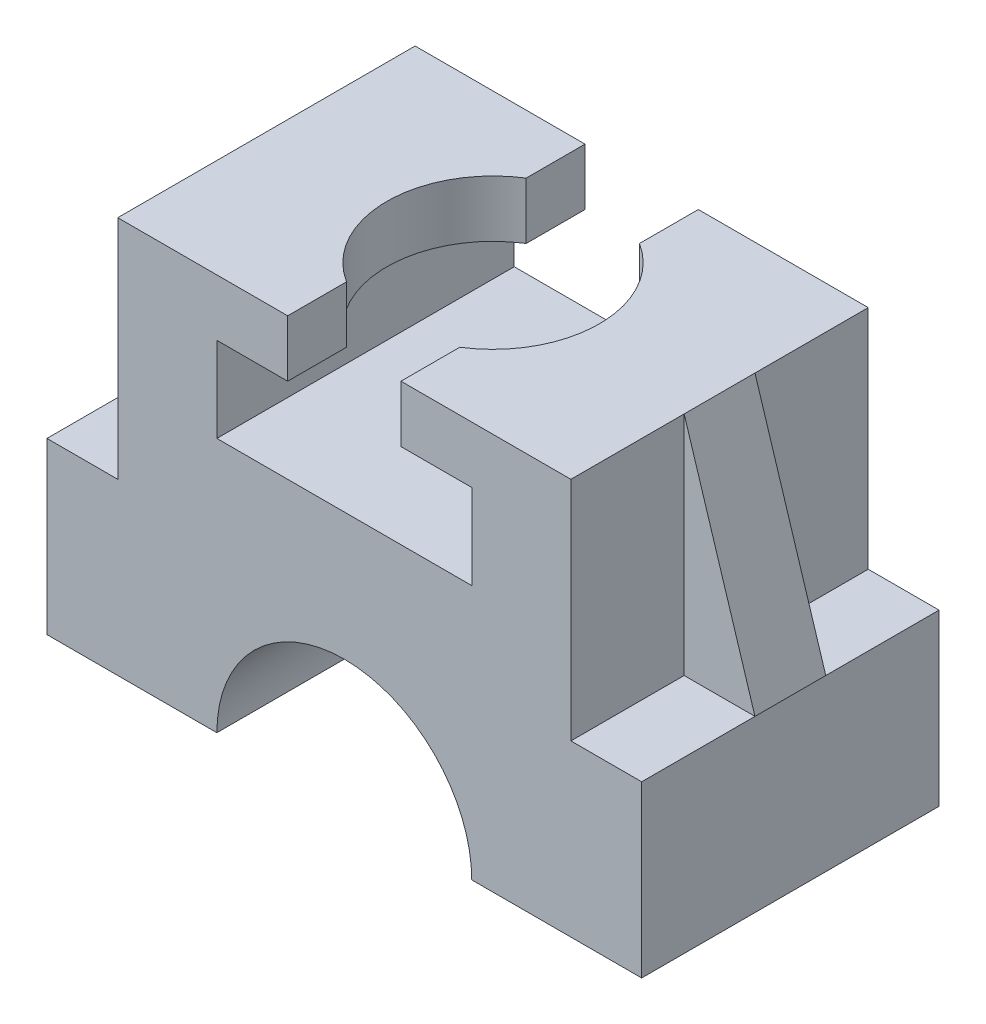
ISO-10303-21;
HEADER;
FILE_DESCRIPTION(('STEP AP214'),'2;1');
FILE_NAME('part.step','',(''),(''),'','','');
FILE_SCHEMA(('AUTOMOTIVE_DESIGN { 1 0 10303 214 1 1 1 1 }'));
ENDSEC;
DATA;
#1=APPLICATION_CONTEXT('core data for automotive mechanical design processes');
#2=APPLICATION_PROTOCOL_DEFINITION('international standard','automotive_design',2000,#1);
#3=PRODUCT_CONTEXT('',#1,'mechanical');
#4=PRODUCT('Part','Part','',(#3));
#5=PRODUCT_RELATED_PRODUCT_CATEGORY('part','',(#4));
#6=PRODUCT_DEFINITION_FORMATION('','',#4);
#7=PRODUCT_DEFINITION_CONTEXT('part definition',#1,'design');
#8=PRODUCT_DEFINITION('design','',#6,#7);
#9=PRODUCT_DEFINITION_SHAPE('','',#8);
#10=(LENGTH_UNIT() NAMED_UNIT(*) SI_UNIT(.MILLI.,.METRE.));
#11=(NAMED_UNIT(*) PLANE_ANGLE_UNIT() SI_UNIT($,.RADIAN.));
#12=(NAMED_UNIT(*) SI_UNIT($,.STERADIAN.) SOLID_ANGLE_UNIT());
#13=UNCERTAINTY_MEASURE_WITH_UNIT(LENGTH_MEASURE(1.E-05),#10,'distance_accuracy_value','');
#14=(GEOMETRIC_REPRESENTATION_CONTEXT(3) GLOBAL_UNCERTAINTY_ASSIGNED_CONTEXT((#13)) GLOBAL_UNIT_ASSIGNED_CONTEXT((#10,
#11,#12)) REPRESENTATION_CONTEXT('',''));
#15=CARTESIAN_POINT('',(0.,0.,0.));
#16=DIRECTION('',(0.,0.,1.));
#17=DIRECTION('',(1.,0.,0.));
#18=AXIS2_PLACEMENT_3D('',#15,#16,#17);
#19=CARTESIAN_POINT('',(-20.,140.,-52.5));
#20=DIRECTION('',(1.,0.,0.));
#21=DIRECTION('',(0.,1.,0.));
#22=AXIS2_PLACEMENT_3D('',#19,#20,#21);
#23=PLANE('',#22);
#24=DIRECTION('',(0.,1.,0.));
#25=VECTOR('',#24,1.);
#26=CARTESIAN_POINT('',(-20.,13.9339828220179,-31.7214438511238));
#27=LINE('',#26,#25);
#28=CARTESIAN_POINT('',(-20.,120.,-31.7214438511238));
#29=VERTEX_POINT('',#28);
#30=CARTESIAN_POINT('',(-20.,140.,-31.7214438511238));
#31=VERTEX_POINT('',#30);
#32=EDGE_CURVE('E381',#29,#31,#27,.T.);
#33=ORIENTED_EDGE('',*,*,#32,.F.);
#34=DIRECTION('',(0.,0.,1.));
#35=VECTOR('',#34,1.);
#36=CARTESIAN_POINT('',(-20.,120.,-52.5));
#37=LINE('',#36,#35);
#38=CARTESIAN_POINT('',(-20.,120.,-52.5));
#39=VERTEX_POINT('',#38);
#40=EDGE_CURVE('E348',#39,#29,#37,.T.);
#41=ORIENTED_EDGE('',*,*,#40,.F.);
#42=DIRECTION('',(0.,1.,0.));
#43=VECTOR('',#42,1.);
#44=CARTESIAN_POINT('',(-20.,140.,-52.5));
#45=LINE('',#44,#43);
#46=CARTESIAN_POINT('',(-20.,140.,-52.5));
#47=VERTEX_POINT('',#46);
#48=EDGE_CURVE('E456',#39,#47,#45,.T.);
#49=ORIENTED_EDGE('',*,*,#48,.T.);
#50=DIRECTION('',(0.,0.,1.));
#51=VECTOR('',#50,1.);
#52=CARTESIAN_POINT('',(-20.,140.,-52.5));
#53=LINE('',#52,#51);
#54=EDGE_CURVE('E344',#47,#31,#53,.T.);
#55=ORIENTED_EDGE('',*,*,#54,.T.);
#56=EDGE_LOOP('',(#33,#41,#49,#55));
#57=FACE_BOUND('',#56,.T.);
#58=ADVANCED_FACE('F32',(#57),#23,.T.);
#59=CARTESIAN_POINT('',(20.,140.,-52.5));
#60=DIRECTION('',(-1.,0.,0.));
#61=DIRECTION('',(0.,-1.,0.));
#62=AXIS2_PLACEMENT_3D('',#59,#60,#61);
#63=PLANE('',#62);
#64=DIRECTION('',(0.,1.,0.));
#65=VECTOR('',#64,1.);
#66=CARTESIAN_POINT('',(20.,13.9339828220179,31.7214438511238));
#67=LINE('',#66,#65);
#68=CARTESIAN_POINT('',(20.,120.,31.7214438511238));
#69=VERTEX_POINT('',#68);
#70=CARTESIAN_POINT('',(20.,140.,31.7214438511238));
#71=VERTEX_POINT('',#70);
#72=EDGE_CURVE('E57',#69,#71,#67,.T.);
#73=ORIENTED_EDGE('',*,*,#72,.F.);
#74=DIRECTION('',(0.,0.,1.));
#75=VECTOR('',#74,1.);
#76=CARTESIAN_POINT('',(20.,120.,-52.5));
#77=LINE('',#76,#75);
#78=CARTESIAN_POINT('',(20.,120.,52.5));
#79=VERTEX_POINT('',#78);
#80=EDGE_CURVE('E240',#69,#79,#77,.T.);
#81=ORIENTED_EDGE('',*,*,#80,.T.);
#82=DIRECTION('',(0.,-1.,0.));
#83=VECTOR('',#82,1.);
#84=CARTESIAN_POINT('',(20.,140.,52.5));
#85=LINE('',#84,#83);
#86=CARTESIAN_POINT('',(20.,140.,52.5));
#87=VERTEX_POINT('',#86);
#88=EDGE_CURVE('E305',#87,#79,#85,.T.);
#89=ORIENTED_EDGE('',*,*,#88,.F.);
#90=DIRECTION('',(0.,0.,1.));
#91=VECTOR('',#90,1.);
#92=CARTESIAN_POINT('',(20.,140.,-52.5));
#93=LINE('',#92,#91);
#94=EDGE_CURVE('E241',#71,#87,#93,.T.);
#95=ORIENTED_EDGE('',*,*,#94,.F.);
#96=EDGE_LOOP('',(#73,#81,#89,#95));
#97=FACE_BOUND('',#96,.T.);
#98=ADVANCED_FACE('F376',(#97),#63,.T.);
#99=CARTESIAN_POINT('',(-105.,60.,-52.5));
#100=DIRECTION('',(0.,1.,0.));
#101=DIRECTION('',(0.,0.,1.));
#102=AXIS2_PLACEMENT_3D('',#99,#100,#101);
#103=PLANE('',#102);
#104=DIRECTION('',(0.,0.,1.));
#105=VECTOR('',#104,1.);
#106=CARTESIAN_POINT('',(-105.,60.,-52.5));
#107=LINE('',#106,#105);
#108=CARTESIAN_POINT('',(-105.,60.,-52.5));
#109=VERTEX_POINT('',#108);
#110=CARTESIAN_POINT('',(-105.,59.9999999999999,-12.5));
#111=VERTEX_POINT('',#110);
#112=EDGE_CURVE('E11',#109,#111,#107,.T.);
#113=ORIENTED_EDGE('',*,*,#112,.T.);
#114=DIRECTION('',(1.,0.,0.));
#115=VECTOR('',#114,1.);
#116=CARTESIAN_POINT('',(-80.,59.9999999999999,-12.5));
#117=LINE('',#116,#115);
#118=CARTESIAN_POINT('',(-80.,59.9999999999999,-12.5));
#119=VERTEX_POINT('',#118);
#120=EDGE_CURVE('E383',#111,#119,#117,.T.);
#121=ORIENTED_EDGE('',*,*,#120,.T.);
#122=DIRECTION('',(0.,0.,1.));
#123=VECTOR('',#122,1.);
#124=CARTESIAN_POINT('',(-80.,60.,-52.5));
#125=LINE('',#124,#123);
#126=CARTESIAN_POINT('',(-80.,60.,-52.5));
#127=VERTEX_POINT('',#126);
#128=EDGE_CURVE('E336',#127,#119,#125,.T.);
#129=ORIENTED_EDGE('',*,*,#128,.F.);
#130=DIRECTION('',(-1.,0.,0.));
#131=VECTOR('',#130,1.);
#132=CARTESIAN_POINT('',(-105.,60.,-52.5));
#133=LINE('',#132,#131);
#134=EDGE_CURVE('E266',#127,#109,#133,.T.);
#135=ORIENTED_EDGE('',*,*,#134,.T.);
#136=EDGE_LOOP('',(#113,#121,#129,#135));
#137=FACE_BOUND('',#136,.T.);
#138=ADVANCED_FACE('F505',(#137),#103,.T.);
#139=CARTESIAN_POINT('',(-80.,60.,-52.5));
#140=DIRECTION('',(-1.,0.,0.));
#141=DIRECTION('',(0.,0.,1.));
#142=AXIS2_PLACEMENT_3D('',#139,#140,#141);
#143=PLANE('',#142);
#144=ORIENTED_EDGE('',*,*,#128,.T.);
#145=DIRECTION('',(0.,1.,0.));
#146=VECTOR('',#145,1.);
#147=CARTESIAN_POINT('',(-80.,140.,-12.5));
#148=LINE('',#147,#146);
#149=CARTESIAN_POINT('',(-80.,140.,-12.5));
#150=VERTEX_POINT('',#149);
#151=EDGE_CURVE('E395',#119,#150,#148,.T.);
#152=ORIENTED_EDGE('',*,*,#151,.T.);
#153=DIRECTION('',(0.,0.,1.));
#154=VECTOR('',#153,1.);
#155=CARTESIAN_POINT('',(-80.,140.,-52.5));
#156=LINE('',#155,#154);
#157=CARTESIAN_POINT('',(-80.,140.,-52.5));
#158=VERTEX_POINT('',#157);
#159=EDGE_CURVE('E340',#158,#150,#156,.T.);
#160=ORIENTED_EDGE('',*,*,#159,.F.);
#161=DIRECTION('',(0.,-1.,0.));
#162=VECTOR('',#161,1.);
#163=CARTESIAN_POINT('',(-80.,60.,-52.5));
#164=LINE('',#163,#162);
#165=EDGE_CURVE('E271',#158,#127,#164,.T.);
#166=ORIENTED_EDGE('',*,*,#165,.T.);
#167=EDGE_LOOP('',(#144,#152,#160,#166));
#168=FACE_BOUND('',#167,.T.);
#169=ADVANCED_FACE('F510',(#168),#143,.T.);
#170=CARTESIAN_POINT('',(80.,60.,-52.5));
#171=DIRECTION('',(1.,0.,0.));
#172=DIRECTION('',(0.,0.,-1.));
#173=AXIS2_PLACEMENT_3D('',#170,#171,#172);
#174=PLANE('',#173);
#175=DIRECTION('',(0.,0.,1.));
#176=VECTOR('',#175,1.);
#177=CARTESIAN_POINT('',(80.,60.,-52.5));
#178=LINE('',#177,#176);
#179=CARTESIAN_POINT('',(80.,60.,12.5));
#180=VERTEX_POINT('',#179);
#181=CARTESIAN_POINT('',(80.,60.,52.5));
#182=VERTEX_POINT('',#181);
#183=EDGE_CURVE('E253',#180,#182,#178,.T.);
#184=ORIENTED_EDGE('',*,*,#183,.F.);
#185=DIRECTION('',(0.,-1.,0.));
#186=VECTOR('',#185,1.);
#187=CARTESIAN_POINT('',(80.,140.,12.5));
#188=LINE('',#187,#186);
#189=CARTESIAN_POINT('',(80.,140.,12.5));
#190=VERTEX_POINT('',#189);
#191=EDGE_CURVE('E406',#190,#180,#188,.T.);
#192=ORIENTED_EDGE('',*,*,#191,.F.);
#193=DIRECTION('',(0.,0.,1.));
#194=VECTOR('',#193,1.);
#195=CARTESIAN_POINT('',(80.,140.,-52.5));
#196=LINE('',#195,#194);
#197=CARTESIAN_POINT('',(80.,140.,52.5));
#198=VERTEX_POINT('',#197);
#199=EDGE_CURVE('E249',#190,#198,#196,.T.);
#200=ORIENTED_EDGE('',*,*,#199,.T.);
#201=DIRECTION('',(0.,1.,0.));
#202=VECTOR('',#201,1.);
#203=CARTESIAN_POINT('',(80.,60.,52.5));
#204=LINE('',#203,#202);
#205=EDGE_CURVE('E299',#182,#198,#204,.T.);
#206=ORIENTED_EDGE('',*,*,#205,.F.);
#207=EDGE_LOOP('',(#184,#192,#200,#206));
#208=FACE_BOUND('',#207,.T.);
#209=ADVANCED_FACE('F662',(#208),#174,.T.);
#210=CARTESIAN_POINT('',(105.,60.,-52.5));
#211=DIRECTION('',(0.,1.,0.));
#212=DIRECTION('',(0.,0.,1.));
#213=AXIS2_PLACEMENT_3D('',#210,#211,#212);
#214=PLANE('',#213);
#215=DIRECTION('',(0.,0.,1.));
#216=VECTOR('',#215,1.);
#217=CARTESIAN_POINT('',(105.,60.,-52.5));
#218=LINE('',#217,#216);
#219=CARTESIAN_POINT('',(105.,60.,12.5));
#220=VERTEX_POINT('',#219);
#221=CARTESIAN_POINT('',(105.,60.,52.5));
#222=VERTEX_POINT('',#221);
#223=EDGE_CURVE('E257',#220,#222,#218,.T.);
#224=ORIENTED_EDGE('',*,*,#223,.F.);
#225=DIRECTION('',(1.,0.,0.));
#226=VECTOR('',#225,1.);
#227=CARTESIAN_POINT('',(80.,60.,12.5));
#228=LINE('',#227,#226);
#229=EDGE_CURVE('E409',#180,#220,#228,.T.);
#230=ORIENTED_EDGE('',*,*,#229,.F.);
#231=ORIENTED_EDGE('',*,*,#183,.T.);
#232=DIRECTION('',(-1.,0.,0.));
#233=VECTOR('',#232,1.);
#234=CARTESIAN_POINT('',(105.,60.,52.5));
#235=LINE('',#234,#233);
#236=EDGE_CURVE('E296',#222,#182,#235,.T.);
#237=ORIENTED_EDGE('',*,*,#236,.F.);
#238=EDGE_LOOP('',(#224,#230,#231,#237));
#239=FACE_BOUND('',#238,.T.);
#240=ADVANCED_FACE('F668',(#239),#214,.T.);
#241=CARTESIAN_POINT('',(-105.,0.,-52.5));
#242=DIRECTION('',(-1.,0.,0.));
#243=DIRECTION('',(0.,0.,1.));
#244=AXIS2_PLACEMENT_3D('',#241,#242,#243);
#245=PLANE('',#244);
#246=DIRECTION('',(0.,-1.,0.));
#247=VECTOR('',#246,1.);
#248=CARTESIAN_POINT('',(-105.,0.,52.5));
#249=LINE('',#248,#247);
#250=CARTESIAN_POINT('',(-105.,60.,52.5));
#251=VERTEX_POINT('',#250);
#252=CARTESIAN_POINT('',(-105.,0.,52.5));
#253=VERTEX_POINT('',#252);
#254=EDGE_CURVE('E280',#251,#253,#249,.T.);
#255=ORIENTED_EDGE('',*,*,#254,.F.);
#256=CARTESIAN_POINT('',(-105.,59.9999999999999,12.5));
#257=VERTEX_POINT('',#256);
#258=EDGE_CURVE('E41',#257,#251,#107,.T.);
#259=ORIENTED_EDGE('',*,*,#258,.F.);
#260=DIRECTION('',(0.,0.,-1.));
#261=VECTOR('',#260,1.);
#262=CARTESIAN_POINT('',(-105.,59.9999999999999,12.5));
#263=LINE('',#262,#261);
#264=EDGE_CURVE('E392',#257,#111,#263,.T.);
#265=ORIENTED_EDGE('',*,*,#264,.T.);
#266=ORIENTED_EDGE('',*,*,#112,.F.);
#267=DIRECTION('',(0.,-1.,0.));
#268=VECTOR('',#267,1.);
#269=CARTESIAN_POINT('',(-105.,0.,-52.5));
#270=LINE('',#269,#268);
#271=CARTESIAN_POINT('',(-105.,0.,-52.5));
#272=VERTEX_POINT('',#271);
#273=EDGE_CURVE('E334',#109,#272,#270,.T.);
#274=ORIENTED_EDGE('',*,*,#273,.T.);
#275=DIRECTION('',(0.,0.,1.));
#276=VECTOR('',#275,1.);
#277=CARTESIAN_POINT('',(-105.,0.,-52.5));
#278=LINE('',#277,#276);
#279=EDGE_CURVE('E36',#272,#253,#278,.T.);
#280=ORIENTED_EDGE('',*,*,#279,.T.);
#281=EDGE_LOOP('',(#255,#259,#265,#266,#274,#280));
#282=FACE_BOUND('',#281,.T.);
#283=ADVANCED_FACE('F34',(#282),#245,.T.);
#284=DIRECTION('',(1.,0.,0.));
#285=VECTOR('',#284,1.);
#286=CARTESIAN_POINT('',(-80.,59.9999999999999,12.5));
#287=LINE('',#286,#285);
#288=CARTESIAN_POINT('',(-80.,59.9999999999999,12.5));
#289=VERTEX_POINT('',#288);
#290=EDGE_CURVE('E384',#257,#289,#287,.T.);
#291=ORIENTED_EDGE('',*,*,#290,.F.);
#292=ORIENTED_EDGE('',*,*,#258,.T.);
#293=DIRECTION('',(-1.,0.,0.));
#294=VECTOR('',#293,1.);
#295=CARTESIAN_POINT('',(-105.,60.,52.5));
#296=LINE('',#295,#294);
#297=CARTESIAN_POINT('',(-80.,60.,52.5));
#298=VERTEX_POINT('',#297);
#299=EDGE_CURVE('E332',#298,#251,#296,.T.);
#300=ORIENTED_EDGE('',*,*,#299,.F.);
#301=EDGE_CURVE('E339',#289,#298,#125,.T.);
#302=ORIENTED_EDGE('',*,*,#301,.F.);
#303=EDGE_LOOP('',(#291,#292,#300,#302));
#304=FACE_BOUND('',#303,.T.);
#305=ADVANCED_FACE('F550',(#304),#103,.T.);
#306=DIRECTION('',(0.,1.,0.));
#307=VECTOR('',#306,1.);
#308=CARTESIAN_POINT('',(-80.,140.,12.5));
#309=LINE('',#308,#307);
#310=CARTESIAN_POINT('',(-80.,140.,12.5));
#311=VERTEX_POINT('',#310);
#312=EDGE_CURVE('E386',#289,#311,#309,.T.);
#313=ORIENTED_EDGE('',*,*,#312,.F.);
#314=ORIENTED_EDGE('',*,*,#301,.T.);
#315=DIRECTION('',(0.,-1.,0.));
#316=VECTOR('',#315,1.);
#317=CARTESIAN_POINT('',(-80.,60.,52.5));
#318=LINE('',#317,#316);
#319=CARTESIAN_POINT('',(-80.,140.,52.5));
#320=VERTEX_POINT('',#319);
#321=EDGE_CURVE('E329',#320,#298,#318,.T.);
#322=ORIENTED_EDGE('',*,*,#321,.F.);
#323=EDGE_CURVE('E343',#311,#320,#156,.T.);
#324=ORIENTED_EDGE('',*,*,#323,.F.);
#325=EDGE_LOOP('',(#313,#314,#322,#324));
#326=FACE_BOUND('',#325,.T.);
#327=ADVANCED_FACE('F521',(#326),#143,.T.);
#328=CARTESIAN_POINT('',(-80.,140.,-52.5));
#329=DIRECTION('',(0.,1.,0.));
#330=DIRECTION('',(0.,0.,1.));
#331=AXIS2_PLACEMENT_3D('',#328,#329,#330);
#332=PLANE('',#331);
#333=CARTESIAN_POINT('',(0.,140.,0.));
#334=DIRECTION('',(0.,1.,0.));
#335=DIRECTION('',(0.,0.,1.));
#336=AXIS2_PLACEMENT_3D('',#333,#334,#335);
#337=CIRCLE('',#336,37.5);
#338=CARTESIAN_POINT('',(-20.,140.,31.7214438511238));
#339=VERTEX_POINT('',#338);
#340=EDGE_CURVE('E225',#31,#339,#337,.T.);
#341=ORIENTED_EDGE('',*,*,#340,.F.);
#342=ORIENTED_EDGE('',*,*,#54,.F.);
#343=DIRECTION('',(-1.,0.,0.));
#344=VECTOR('',#343,1.);
#345=CARTESIAN_POINT('',(-80.,140.,-52.5));
#346=LINE('',#345,#344);
#347=EDGE_CURVE('E276',#47,#158,#346,.T.);
#348=ORIENTED_EDGE('',*,*,#347,.T.);
#349=ORIENTED_EDGE('',*,*,#159,.T.);
#350=DIRECTION('',(0.,0.,-1.));
#351=VECTOR('',#350,1.);
#352=CARTESIAN_POINT('',(-80.,140.,12.5));
#353=LINE('',#352,#351);
#354=EDGE_CURVE('E401',#311,#150,#353,.T.);
#355=ORIENTED_EDGE('',*,*,#354,.F.);
#356=ORIENTED_EDGE('',*,*,#323,.T.);
#357=DIRECTION('',(-1.,0.,0.));
#358=VECTOR('',#357,1.);
#359=CARTESIAN_POINT('',(-80.,140.,52.5));
#360=LINE('',#359,#358);
#361=CARTESIAN_POINT('',(-20.,140.,52.5));
#362=VERTEX_POINT('',#361);
#363=EDGE_CURVE('E326',#362,#320,#360,.T.);
#364=ORIENTED_EDGE('',*,*,#363,.F.);
#365=EDGE_CURVE('E347',#339,#362,#53,.T.);
#366=ORIENTED_EDGE('',*,*,#365,.F.);
#367=EDGE_LOOP('',(#341,#342,#348,#349,#355,#356,#364,#366));
#368=FACE_BOUND('',#367,.T.);
#369=ADVANCED_FACE('F462',(#368),#332,.T.);
#370=DIRECTION('',(0.,1.,0.));
#371=VECTOR('',#370,1.);
#372=CARTESIAN_POINT('',(-20.,13.9339828220179,31.7214438511238));
#373=LINE('',#372,#371);
#374=CARTESIAN_POINT('',(-20.,120.,31.7214438511238));
#375=VERTEX_POINT('',#374);
#376=EDGE_CURVE('E49',#339,#375,#373,.F.);
#377=ORIENTED_EDGE('',*,*,#376,.F.);
#378=ORIENTED_EDGE('',*,*,#365,.T.);
#379=DIRECTION('',(0.,1.,0.));
#380=VECTOR('',#379,1.);
#381=CARTESIAN_POINT('',(-20.,140.,52.5));
#382=LINE('',#381,#380);
#383=CARTESIAN_POINT('',(-20.,120.,52.5));
#384=VERTEX_POINT('',#383);
#385=EDGE_CURVE('E323',#384,#362,#382,.T.);
#386=ORIENTED_EDGE('',*,*,#385,.F.);
#387=EDGE_CURVE('E351',#375,#384,#37,.T.);
#388=ORIENTED_EDGE('',*,*,#387,.F.);
#389=EDGE_LOOP('',(#377,#378,#386,#388));
#390=FACE_BOUND('',#389,.T.);
#391=ADVANCED_FACE('F526',(#390),#23,.T.);
#392=CARTESIAN_POINT('',(-20.,120.,-52.5));
#393=DIRECTION('',(0.,-1.,0.));
#394=DIRECTION('',(0.,0.,-1.));
#395=AXIS2_PLACEMENT_3D('',#392,#393,#394);
#396=PLANE('',#395);
#397=CARTESIAN_POINT('',(0.,120.,0.));
#398=DIRECTION('',(0.,-1.,0.));
#399=DIRECTION('',(0.,0.,-1.));
#400=AXIS2_PLACEMENT_3D('',#397,#398,#399);
#401=CIRCLE('',#400,37.5);
#402=EDGE_CURVE('E234',#29,#375,#401,.F.);
#403=ORIENTED_EDGE('',*,*,#402,.T.);
#404=ORIENTED_EDGE('',*,*,#387,.T.);
#405=DIRECTION('',(1.,0.,0.));
#406=VECTOR('',#405,1.);
#407=CARTESIAN_POINT('',(-20.,120.,52.5));
#408=LINE('',#407,#406);
#409=CARTESIAN_POINT('',(-45.,120.,52.5));
#410=VERTEX_POINT('',#409);
#411=EDGE_CURVE('E320',#410,#384,#408,.T.);
#412=ORIENTED_EDGE('',*,*,#411,.F.);
#413=DIRECTION('',(0.,0.,1.));
#414=VECTOR('',#413,1.);
#415=CARTESIAN_POINT('',(-45.,120.,-52.5));
#416=LINE('',#415,#414);
#417=CARTESIAN_POINT('',(-45.,120.,-52.5));
#418=VERTEX_POINT('',#417);
#419=EDGE_CURVE('E352',#418,#410,#416,.T.);
#420=ORIENTED_EDGE('',*,*,#419,.F.);
#421=DIRECTION('',(1.,0.,0.));
#422=VECTOR('',#421,1.);
#423=CARTESIAN_POINT('',(-20.,120.,-52.5));
#424=LINE('',#423,#422);
#425=EDGE_CURVE('E453',#418,#39,#424,.T.);
#426=ORIENTED_EDGE('',*,*,#425,.T.);
#427=ORIENTED_EDGE('',*,*,#40,.T.);
#428=EDGE_LOOP('',(#403,#404,#412,#420,#426,#427));
#429=FACE_BOUND('',#428,.T.);
#430=ADVANCED_FACE('F473',(#429),#396,.T.);
#431=CARTESIAN_POINT('',(-45.,120.,-52.5));
#432=DIRECTION('',(1.,0.,0.));
#433=DIRECTION('',(0.,1.,0.));
#434=AXIS2_PLACEMENT_3D('',#431,#432,#433);
#435=PLANE('',#434);
#436=DIRECTION('',(0.,1.,0.));
#437=VECTOR('',#436,1.);
#438=CARTESIAN_POINT('',(-45.,120.,52.5));
#439=LINE('',#438,#437);
#440=CARTESIAN_POINT('',(-45.,90.,52.5));
#441=VERTEX_POINT('',#440);
#442=EDGE_CURVE('E317',#441,#410,#439,.T.);
#443=ORIENTED_EDGE('',*,*,#442,.F.);
#444=DIRECTION('',(0.,0.,1.));
#445=VECTOR('',#444,1.);
#446=CARTESIAN_POINT('',(-45.,90.,-52.5));
#447=LINE('',#446,#445);
#448=CARTESIAN_POINT('',(-45.,90.,-52.5));
#449=VERTEX_POINT('',#448);
#450=EDGE_CURVE('E354',#449,#441,#447,.T.);
#451=ORIENTED_EDGE('',*,*,#450,.F.);
#452=DIRECTION('',(0.,1.,0.));
#453=VECTOR('',#452,1.);
#454=CARTESIAN_POINT('',(-45.,120.,-52.5));
#455=LINE('',#454,#453);
#456=EDGE_CURVE('E450',#449,#418,#455,.T.);
#457=ORIENTED_EDGE('',*,*,#456,.T.);
#458=ORIENTED_EDGE('',*,*,#419,.T.);
#459=EDGE_LOOP('',(#443,#451,#457,#458));
#460=FACE_BOUND('',#459,.T.);
#461=ADVANCED_FACE('F480',(#460),#435,.T.);
#462=CARTESIAN_POINT('',(-45.,90.,-52.5));
#463=DIRECTION('',(0.,1.,0.));
#464=DIRECTION('',(-1.,0.,0.));
#465=AXIS2_PLACEMENT_3D('',#462,#463,#464);
#466=PLANE('',#465);
#467=DIRECTION('',(-1.,0.,0.));
#468=VECTOR('',#467,1.);
#469=CARTESIAN_POINT('',(-45.,90.,52.5));
#470=LINE('',#469,#468);
#471=CARTESIAN_POINT('',(45.,90.,52.5));
#472=VERTEX_POINT('',#471);
#473=EDGE_CURVE('E314',#472,#441,#470,.T.);
#474=ORIENTED_EDGE('',*,*,#473,.F.);
#475=DIRECTION('',(0.,0.,1.));
#476=VECTOR('',#475,1.);
#477=CARTESIAN_POINT('',(45.,90.,-52.5));
#478=LINE('',#477,#476);
#479=CARTESIAN_POINT('',(45.,90.,-52.5));
#480=VERTEX_POINT('',#479);
#481=EDGE_CURVE('E356',#480,#472,#478,.T.);
#482=ORIENTED_EDGE('',*,*,#481,.F.);
#483=DIRECTION('',(-1.,0.,0.));
#484=VECTOR('',#483,1.);
#485=CARTESIAN_POINT('',(-45.,90.,-52.5));
#486=LINE('',#485,#484);
#487=EDGE_CURVE('E447',#480,#449,#486,.T.);
#488=ORIENTED_EDGE('',*,*,#487,.T.);
#489=ORIENTED_EDGE('',*,*,#450,.T.);
#490=EDGE_LOOP('',(#474,#482,#488,#489));
#491=FACE_BOUND('',#490,.T.);
#492=ADVANCED_FACE('F482',(#491),#466,.T.);
#493=CARTESIAN_POINT('',(45.,120.,-52.5));
#494=DIRECTION('',(-1.,0.,0.));
#495=DIRECTION('',(0.,-1.,0.));
#496=AXIS2_PLACEMENT_3D('',#493,#494,#495);
#497=PLANE('',#496);
#498=DIRECTION('',(0.,-1.,0.));
#499=VECTOR('',#498,1.);
#500=CARTESIAN_POINT('',(45.,120.,52.5));
#501=LINE('',#500,#499);
#502=CARTESIAN_POINT('',(45.,120.,52.5));
#503=VERTEX_POINT('',#502);
#504=EDGE_CURVE('E311',#503,#472,#501,.T.);
#505=ORIENTED_EDGE('',*,*,#504,.F.);
#506=DIRECTION('',(0.,0.,1.));
#507=VECTOR('',#506,1.);
#508=CARTESIAN_POINT('',(45.,120.,-52.5));
#509=LINE('',#508,#507);
#510=CARTESIAN_POINT('',(45.,120.,-52.5));
#511=VERTEX_POINT('',#510);
#512=EDGE_CURVE('E357',#511,#503,#509,.T.);
#513=ORIENTED_EDGE('',*,*,#512,.F.);
#514=DIRECTION('',(0.,-1.,0.));
#515=VECTOR('',#514,1.);
#516=CARTESIAN_POINT('',(45.,120.,-52.5));
#517=LINE('',#516,#515);
#518=EDGE_CURVE('E445',#511,#480,#517,.T.);
#519=ORIENTED_EDGE('',*,*,#518,.T.);
#520=ORIENTED_EDGE('',*,*,#481,.T.);
#521=EDGE_LOOP('',(#505,#513,#519,#520));
#522=FACE_BOUND('',#521,.T.);
#523=ADVANCED_FACE('F369',(#522),#497,.T.);
#524=CARTESIAN_POINT('',(20.,120.,-52.5));
#525=DIRECTION('',(0.,-1.,0.));
#526=DIRECTION('',(0.,0.,-1.));
#527=AXIS2_PLACEMENT_3D('',#524,#525,#526);
#528=PLANE('',#527);
#529=CARTESIAN_POINT('',(20.,120.,-31.7214438511238));
#530=VERTEX_POINT('',#529);
#531=EDGE_CURVE('E224',#69,#530,#401,.F.);
#532=ORIENTED_EDGE('',*,*,#531,.T.);
#533=CARTESIAN_POINT('',(20.,120.,-52.5));
#534=VERTEX_POINT('',#533);
#535=EDGE_CURVE('E233',#534,#530,#77,.T.);
#536=ORIENTED_EDGE('',*,*,#535,.F.);
#537=DIRECTION('',(1.,0.,0.));
#538=VECTOR('',#537,1.);
#539=CARTESIAN_POINT('',(20.,120.,-52.5));
#540=LINE('',#539,#538);
#541=EDGE_CURVE('E365',#534,#511,#540,.T.);
#542=ORIENTED_EDGE('',*,*,#541,.T.);
#543=ORIENTED_EDGE('',*,*,#512,.T.);
#544=DIRECTION('',(1.,0.,0.));
#545=VECTOR('',#544,1.);
#546=CARTESIAN_POINT('',(20.,120.,52.5));
#547=LINE('',#546,#545);
#548=EDGE_CURVE('E308',#79,#503,#547,.T.);
#549=ORIENTED_EDGE('',*,*,#548,.F.);
#550=ORIENTED_EDGE('',*,*,#80,.F.);
#551=EDGE_LOOP('',(#532,#536,#542,#543,#549,#550));
#552=FACE_BOUND('',#551,.T.);
#553=ADVANCED_FACE('F362',(#552),#528,.T.);
#554=DIRECTION('',(0.,1.,0.));
#555=VECTOR('',#554,1.);
#556=CARTESIAN_POINT('',(20.,13.9339828220179,-31.7214438511238));
#557=LINE('',#556,#555);
#558=CARTESIAN_POINT('',(20.,140.,-31.7214438511238));
#559=VERTEX_POINT('',#558);
#560=EDGE_CURVE('E219',#559,#530,#557,.F.);
#561=ORIENTED_EDGE('',*,*,#560,.F.);
#562=CARTESIAN_POINT('',(20.,140.,-52.5));
#563=VERTEX_POINT('',#562);
#564=EDGE_CURVE('E231',#563,#559,#93,.T.);
#565=ORIENTED_EDGE('',*,*,#564,.F.);
#566=DIRECTION('',(0.,-1.,0.));
#567=VECTOR('',#566,1.);
#568=CARTESIAN_POINT('',(20.,140.,-52.5));
#569=LINE('',#568,#567);
#570=EDGE_CURVE('E442',#563,#534,#569,.T.);
#571=ORIENTED_EDGE('',*,*,#570,.T.);
#572=ORIENTED_EDGE('',*,*,#535,.T.);
#573=EDGE_LOOP('',(#561,#565,#571,#572));
#574=FACE_BOUND('',#573,.T.);
#575=ADVANCED_FACE('F229',(#574),#63,.T.);
#576=CARTESIAN_POINT('',(80.,140.,-52.5));
#577=DIRECTION('',(0.,1.,0.));
#578=DIRECTION('',(0.,0.,1.));
#579=AXIS2_PLACEMENT_3D('',#576,#577,#578);
#580=PLANE('',#579);
#581=EDGE_CURVE('E216',#71,#559,#337,.T.);
#582=ORIENTED_EDGE('',*,*,#581,.F.);
#583=ORIENTED_EDGE('',*,*,#94,.T.);
#584=DIRECTION('',(-1.,0.,0.));
#585=VECTOR('',#584,1.);
#586=CARTESIAN_POINT('',(80.,140.,52.5));
#587=LINE('',#586,#585);
#588=EDGE_CURVE('E302',#198,#87,#587,.T.);
#589=ORIENTED_EDGE('',*,*,#588,.F.);
#590=ORIENTED_EDGE('',*,*,#199,.F.);
#591=DIRECTION('',(0.,0.,-1.));
#592=VECTOR('',#591,1.);
#593=CARTESIAN_POINT('',(80.,140.,12.5));
#594=LINE('',#593,#592);
#595=CARTESIAN_POINT('',(80.,140.,-12.5));
#596=VERTEX_POINT('',#595);
#597=EDGE_CURVE('E284',#190,#596,#594,.T.);
#598=ORIENTED_EDGE('',*,*,#597,.T.);
#599=CARTESIAN_POINT('',(80.,140.,-52.5));
#600=VERTEX_POINT('',#599);
#601=EDGE_CURVE('E244',#600,#596,#196,.T.);
#602=ORIENTED_EDGE('',*,*,#601,.F.);
#603=DIRECTION('',(-1.,0.,0.));
#604=VECTOR('',#603,1.);
#605=CARTESIAN_POINT('',(80.,140.,-52.5));
#606=LINE('',#605,#604);
#607=EDGE_CURVE('E239',#600,#563,#606,.T.);
#608=ORIENTED_EDGE('',*,*,#607,.T.);
#609=ORIENTED_EDGE('',*,*,#564,.T.);
#610=EDGE_LOOP('',(#582,#583,#589,#590,#598,#602,#608,#609));
#611=FACE_BOUND('',#610,.T.);
#612=ADVANCED_FACE('F237',(#611),#580,.T.);
#613=DIRECTION('',(0.,-1.,0.));
#614=VECTOR('',#613,1.);
#615=CARTESIAN_POINT('',(80.,140.,-12.5));
#616=LINE('',#615,#614);
#617=CARTESIAN_POINT('',(80.,60.,-12.5));
#618=VERTEX_POINT('',#617);
#619=EDGE_CURVE('E415',#596,#618,#616,.T.);
#620=ORIENTED_EDGE('',*,*,#619,.T.);
#621=CARTESIAN_POINT('',(80.,60.,-52.5));
#622=VERTEX_POINT('',#621);
#623=EDGE_CURVE('E250',#622,#618,#178,.T.);
#624=ORIENTED_EDGE('',*,*,#623,.F.);
#625=DIRECTION('',(0.,1.,0.));
#626=VECTOR('',#625,1.);
#627=CARTESIAN_POINT('',(80.,60.,-52.5));
#628=LINE('',#627,#626);
#629=EDGE_CURVE('E438',#622,#600,#628,.T.);
#630=ORIENTED_EDGE('',*,*,#629,.T.);
#631=ORIENTED_EDGE('',*,*,#601,.T.);
#632=EDGE_LOOP('',(#620,#624,#630,#631));
#633=FACE_BOUND('',#632,.T.);
#634=ADVANCED_FACE('F486',(#633),#174,.T.);
#635=DIRECTION('',(1.,0.,0.));
#636=VECTOR('',#635,1.);
#637=CARTESIAN_POINT('',(80.,60.,-12.5));
#638=LINE('',#637,#636);
#639=CARTESIAN_POINT('',(105.,60.,-12.5));
#640=VERTEX_POINT('',#639);
#641=EDGE_CURVE('E407',#618,#640,#638,.T.);
#642=ORIENTED_EDGE('',*,*,#641,.T.);
#643=CARTESIAN_POINT('',(105.,60.,-52.5));
#644=VERTEX_POINT('',#643);
#645=EDGE_CURVE('E254',#644,#640,#218,.T.);
#646=ORIENTED_EDGE('',*,*,#645,.F.);
#647=DIRECTION('',(-1.,0.,0.));
#648=VECTOR('',#647,1.);
#649=CARTESIAN_POINT('',(105.,60.,-52.5));
#650=LINE('',#649,#648);
#651=EDGE_CURVE('E435',#644,#622,#650,.T.);
#652=ORIENTED_EDGE('',*,*,#651,.T.);
#653=ORIENTED_EDGE('',*,*,#623,.T.);
#654=EDGE_LOOP('',(#642,#646,#652,#653));
#655=FACE_BOUND('',#654,.T.);
#656=ADVANCED_FACE('F488',(#655),#214,.T.);
#657=CARTESIAN_POINT('',(105.,0.,-52.5));
#658=DIRECTION('',(1.,0.,0.));
#659=DIRECTION('',(0.,0.,-1.));
#660=AXIS2_PLACEMENT_3D('',#657,#658,#659);
#661=PLANE('',#660);
#662=DIRECTION('',(0.,1.,0.));
#663=VECTOR('',#662,1.);
#664=CARTESIAN_POINT('',(105.,0.,52.5));
#665=LINE('',#664,#663);
#666=CARTESIAN_POINT('',(105.,0.,52.5));
#667=VERTEX_POINT('',#666);
#668=EDGE_CURVE('E293',#667,#222,#665,.T.);
#669=ORIENTED_EDGE('',*,*,#668,.F.);
#670=DIRECTION('',(0.,0.,1.));
#671=VECTOR('',#670,1.);
#672=CARTESIAN_POINT('',(105.,0.,-52.5));
#673=LINE('',#672,#671);
#674=CARTESIAN_POINT('',(105.,0.,-52.5));
#675=VERTEX_POINT('',#674);
#676=EDGE_CURVE('E258',#675,#667,#673,.T.);
#677=ORIENTED_EDGE('',*,*,#676,.F.);
#678=DIRECTION('',(0.,1.,0.));
#679=VECTOR('',#678,1.);
#680=CARTESIAN_POINT('',(105.,0.,-52.5));
#681=LINE('',#680,#679);
#682=EDGE_CURVE('E432',#675,#644,#681,.T.);
#683=ORIENTED_EDGE('',*,*,#682,.T.);
#684=ORIENTED_EDGE('',*,*,#645,.T.);
#685=DIRECTION('',(0.,0.,-1.));
#686=VECTOR('',#685,1.);
#687=CARTESIAN_POINT('',(105.,60.,12.5));
#688=LINE('',#687,#686);
#689=EDGE_CURVE('E412',#220,#640,#688,.T.);
#690=ORIENTED_EDGE('',*,*,#689,.F.);
#691=ORIENTED_EDGE('',*,*,#223,.T.);
#692=EDGE_LOOP('',(#669,#677,#683,#684,#690,#691));
#693=FACE_BOUND('',#692,.T.);
#694=ADVANCED_FACE('F493',(#693),#661,.T.);
#695=CARTESIAN_POINT('',(105.,0.,-52.5));
#696=DIRECTION('',(0.,-1.,0.));
#697=DIRECTION('',(0.,0.,-1.));
#698=AXIS2_PLACEMENT_3D('',#695,#696,#697);
#699=PLANE('',#698);
#700=DIRECTION('',(1.,0.,0.));
#701=VECTOR('',#700,1.);
#702=CARTESIAN_POINT('',(105.,0.,52.5));
#703=LINE('',#702,#701);
#704=CARTESIAN_POINT('',(45.,0.,52.5));
#705=VERTEX_POINT('',#704);
#706=EDGE_CURVE('E290',#705,#667,#703,.T.);
#707=ORIENTED_EDGE('',*,*,#706,.F.);
#708=DIRECTION('',(0.,0.,1.));
#709=VECTOR('',#708,1.);
#710=CARTESIAN_POINT('',(45.,0.,-52.5));
#711=LINE('',#710,#709);
#712=CARTESIAN_POINT('',(45.,0.,-52.5));
#713=VERTEX_POINT('',#712);
#714=EDGE_CURVE('E260',#713,#705,#711,.T.);
#715=ORIENTED_EDGE('',*,*,#714,.F.);
#716=DIRECTION('',(1.,0.,0.));
#717=VECTOR('',#716,1.);
#718=CARTESIAN_POINT('',(105.,0.,-52.5));
#719=LINE('',#718,#717);
#720=EDGE_CURVE('E429',#713,#675,#719,.T.);
#721=ORIENTED_EDGE('',*,*,#720,.T.);
#722=ORIENTED_EDGE('',*,*,#676,.T.);
#723=EDGE_LOOP('',(#707,#715,#721,#722));
#724=FACE_BOUND('',#723,.T.);
#725=ADVANCED_FACE('F497',(#724),#699,.T.);
#726=CARTESIAN_POINT('',(0.,0.,-52.5));
#727=DIRECTION('',(0.,0.,1.));
#728=DIRECTION('',(1.,0.,0.));
#729=AXIS2_PLACEMENT_3D('',#726,#727,#728);
#730=CYLINDRICAL_SURFACE('',#729,45.);
#731=CARTESIAN_POINT('',(0.,0.,52.5));
#732=DIRECTION('',(0.,0.,-1.));
#733=DIRECTION('',(1.,0.,0.));
#734=AXIS2_PLACEMENT_3D('',#731,#732,#733);
#735=CIRCLE('',#734,45.);
#736=CARTESIAN_POINT('',(-45.,0.,52.5));
#737=VERTEX_POINT('',#736);
#738=EDGE_CURVE('E287',#737,#705,#735,.T.);
#739=ORIENTED_EDGE('',*,*,#738,.F.);
#740=DIRECTION('',(0.,0.,1.));
#741=VECTOR('',#740,1.);
#742=CARTESIAN_POINT('',(-45.,0.,-52.5));
#743=LINE('',#742,#741);
#744=CARTESIAN_POINT('',(-45.,0.,-52.5));
#745=VERTEX_POINT('',#744);
#746=EDGE_CURVE('E261',#745,#737,#743,.T.);
#747=ORIENTED_EDGE('',*,*,#746,.F.);
#748=CARTESIAN_POINT('',(0.,0.,-52.5));
#749=DIRECTION('',(0.,0.,-1.));
#750=DIRECTION('',(1.,0.,0.));
#751=AXIS2_PLACEMENT_3D('',#748,#749,#750);
#752=CIRCLE('',#751,45.);
#753=EDGE_CURVE('E426',#745,#713,#752,.T.);
#754=ORIENTED_EDGE('',*,*,#753,.T.);
#755=ORIENTED_EDGE('',*,*,#714,.T.);
#756=EDGE_LOOP('',(#739,#747,#754,#755));
#757=FACE_BOUND('',#756,.T.);
#758=ADVANCED_FACE('F501',(#757),#730,.F.);
#759=CARTESIAN_POINT('',(-105.,0.,-52.5));
#760=DIRECTION('',(0.,-1.,0.));
#761=DIRECTION('',(0.,0.,-1.));
#762=AXIS2_PLACEMENT_3D('',#759,#760,#761);
#763=PLANE('',#762);
#764=DIRECTION('',(1.,0.,0.));
#765=VECTOR('',#764,1.);
#766=CARTESIAN_POINT('',(-105.,0.,52.5));
#767=LINE('',#766,#765);
#768=EDGE_CURVE('E283',#253,#737,#767,.T.);
#769=ORIENTED_EDGE('',*,*,#768,.F.);
#770=ORIENTED_EDGE('',*,*,#279,.F.);
#771=DIRECTION('',(1.,0.,0.));
#772=VECTOR('',#771,1.);
#773=CARTESIAN_POINT('',(-105.,0.,-52.5));
#774=LINE('',#773,#772);
#775=EDGE_CURVE('E424',#272,#745,#774,.T.);
#776=ORIENTED_EDGE('',*,*,#775,.T.);
#777=ORIENTED_EDGE('',*,*,#746,.T.);
#778=EDGE_LOOP('',(#769,#770,#776,#777));
#779=FACE_BOUND('',#778,.T.);
#780=ADVANCED_FACE('F502',(#779),#763,.T.);
#781=CARTESIAN_POINT('',(0.,0.,-52.5));
#782=DIRECTION('',(0.,0.,1.));
#783=DIRECTION('',(1.,0.,0.));
#784=AXIS2_PLACEMENT_3D('',#781,#782,#783);
#785=PLANE('',#784);
#786=ORIENTED_EDGE('',*,*,#273,.F.);
#787=ORIENTED_EDGE('',*,*,#134,.F.);
#788=ORIENTED_EDGE('',*,*,#165,.F.);
#789=ORIENTED_EDGE('',*,*,#347,.F.);
#790=ORIENTED_EDGE('',*,*,#48,.F.);
#791=ORIENTED_EDGE('',*,*,#425,.F.);
#792=ORIENTED_EDGE('',*,*,#456,.F.);
#793=ORIENTED_EDGE('',*,*,#487,.F.);
#794=ORIENTED_EDGE('',*,*,#518,.F.);
#795=ORIENTED_EDGE('',*,*,#541,.F.);
#796=ORIENTED_EDGE('',*,*,#570,.F.);
#797=ORIENTED_EDGE('',*,*,#607,.F.);
#798=ORIENTED_EDGE('',*,*,#629,.F.);
#799=ORIENTED_EDGE('',*,*,#651,.F.);
#800=ORIENTED_EDGE('',*,*,#682,.F.);
#801=ORIENTED_EDGE('',*,*,#720,.F.);
#802=ORIENTED_EDGE('',*,*,#753,.F.);
#803=ORIENTED_EDGE('',*,*,#775,.F.);
#804=EDGE_LOOP('',(#786,#787,#788,#789,#790,#791,#792,#793,#794,#795,#796,#797,#798,#799,#800,
#801,#802,#803));
#805=FACE_BOUND('',#804,.T.);
#806=ADVANCED_FACE('F468',(#805),#785,.F.);
#807=CARTESIAN_POINT('',(0.,0.,52.5));
#808=DIRECTION('',(0.,0.,1.));
#809=DIRECTION('',(1.,0.,0.));
#810=AXIS2_PLACEMENT_3D('',#807,#808,#809);
#811=PLANE('',#810);
#812=ORIENTED_EDGE('',*,*,#254,.T.);
#813=ORIENTED_EDGE('',*,*,#768,.T.);
#814=ORIENTED_EDGE('',*,*,#738,.T.);
#815=ORIENTED_EDGE('',*,*,#706,.T.);
#816=ORIENTED_EDGE('',*,*,#668,.T.);
#817=ORIENTED_EDGE('',*,*,#236,.T.);
#818=ORIENTED_EDGE('',*,*,#205,.T.);
#819=ORIENTED_EDGE('',*,*,#588,.T.);
#820=ORIENTED_EDGE('',*,*,#88,.T.);
#821=ORIENTED_EDGE('',*,*,#548,.T.);
#822=ORIENTED_EDGE('',*,*,#504,.T.);
#823=ORIENTED_EDGE('',*,*,#473,.T.);
#824=ORIENTED_EDGE('',*,*,#442,.T.);
#825=ORIENTED_EDGE('',*,*,#411,.T.);
#826=ORIENTED_EDGE('',*,*,#385,.T.);
#827=ORIENTED_EDGE('',*,*,#363,.T.);
#828=ORIENTED_EDGE('',*,*,#321,.T.);
#829=ORIENTED_EDGE('',*,*,#299,.T.);
#830=EDGE_LOOP('',(#812,#813,#814,#815,#816,#817,#818,#819,#820,#821,#822,#823,#824,#825,#826,
#827,#828,#829));
#831=FACE_BOUND('',#830,.T.);
#832=ADVANCED_FACE('F372',(#831),#811,.T.);
#833=CARTESIAN_POINT('',(105.,60.,12.5));
#834=DIRECTION('',(-0.95447997803503,-0.298274993135947,0.));
#835=DIRECTION('',(0.298274993135947,-0.95447997803503,0.));
#836=AXIS2_PLACEMENT_3D('',#833,#834,#835);
#837=PLANE('',#836);
#838=DIRECTION('',(-0.298274993135947,0.95447997803503,0.));
#839=VECTOR('',#838,1.);
#840=CARTESIAN_POINT('',(105.,60.,-12.5));
#841=LINE('',#840,#839);
#842=EDGE_CURVE('E403',#640,#596,#841,.T.);
#843=ORIENTED_EDGE('',*,*,#842,.T.);
#844=ORIENTED_EDGE('',*,*,#597,.F.);
#845=DIRECTION('',(-0.298274993135947,0.95447997803503,0.));
#846=VECTOR('',#845,1.);
#847=CARTESIAN_POINT('',(105.,60.,12.5));
#848=LINE('',#847,#846);
#849=EDGE_CURVE('E404',#220,#190,#848,.T.);
#850=ORIENTED_EDGE('',*,*,#849,.F.);
#851=ORIENTED_EDGE('',*,*,#689,.T.);
#852=EDGE_LOOP('',(#843,#844,#850,#851));
#853=FACE_BOUND('',#852,.T.);
#854=ADVANCED_FACE('F558',(#853),#837,.F.);
#855=CARTESIAN_POINT('',(0.,0.,12.5));
#856=DIRECTION('',(0.,0.,-1.));
#857=DIRECTION('',(-1.,0.,0.));
#858=AXIS2_PLACEMENT_3D('',#855,#856,#857);
#859=PLANE('',#858);
#860=ORIENTED_EDGE('',*,*,#849,.T.);
#861=ORIENTED_EDGE('',*,*,#191,.T.);
#862=ORIENTED_EDGE('',*,*,#229,.T.);
#863=EDGE_LOOP('',(#860,#861,#862));
#864=FACE_BOUND('',#863,.T.);
#865=ADVANCED_FACE('F563',(#864),#859,.F.);
#866=CARTESIAN_POINT('',(0.,0.,-12.5));
#867=DIRECTION('',(0.,0.,-1.));
#868=DIRECTION('',(-1.,0.,0.));
#869=AXIS2_PLACEMENT_3D('',#866,#867,#868);
#870=PLANE('',#869);
#871=ORIENTED_EDGE('',*,*,#842,.F.);
#872=ORIENTED_EDGE('',*,*,#641,.F.);
#873=ORIENTED_EDGE('',*,*,#619,.F.);
#874=EDGE_LOOP('',(#871,#872,#873));
#875=FACE_BOUND('',#874,.T.);
#876=ADVANCED_FACE('F565',(#875),#870,.T.);
#877=CARTESIAN_POINT('',(-105.,59.9999999999999,12.5));
#878=DIRECTION('',(0.95447997803503,-0.298274993135947,0.));
#879=DIRECTION('',(0.298274993135947,0.95447997803503,0.));
#880=AXIS2_PLACEMENT_3D('',#877,#878,#879);
#881=PLANE('',#880);
#882=DIRECTION('',(-0.298274993135947,-0.95447997803503,0.));
#883=VECTOR('',#882,1.);
#884=CARTESIAN_POINT('',(-105.,59.9999999999999,-12.5));
#885=LINE('',#884,#883);
#886=EDGE_CURVE('E387',#150,#111,#885,.T.);
#887=ORIENTED_EDGE('',*,*,#886,.T.);
#888=ORIENTED_EDGE('',*,*,#264,.F.);
#889=DIRECTION('',(-0.298274993135947,-0.95447997803503,0.));
#890=VECTOR('',#889,1.);
#891=CARTESIAN_POINT('',(-105.,59.9999999999999,12.5));
#892=LINE('',#891,#890);
#893=EDGE_CURVE('E390',#311,#257,#892,.T.);
#894=ORIENTED_EDGE('',*,*,#893,.F.);
#895=ORIENTED_EDGE('',*,*,#354,.T.);
#896=EDGE_LOOP('',(#887,#888,#894,#895));
#897=FACE_BOUND('',#896,.T.);
#898=ADVANCED_FACE('F513',(#897),#881,.F.);
#899=CARTESIAN_POINT('',(0.,0.,12.5));
#900=DIRECTION('',(0.,0.,1.));
#901=DIRECTION('',(1.,0.,0.));
#902=AXIS2_PLACEMENT_3D('',#899,#900,#901);
#903=PLANE('',#902);
#904=ORIENTED_EDGE('',*,*,#290,.T.);
#905=ORIENTED_EDGE('',*,*,#312,.T.);
#906=ORIENTED_EDGE('',*,*,#893,.T.);
#907=EDGE_LOOP('',(#904,#905,#906));
#908=FACE_BOUND('',#907,.T.);
#909=ADVANCED_FACE('F574',(#908),#903,.T.);
#910=CARTESIAN_POINT('',(0.,0.,-12.5));
#911=DIRECTION('',(0.,0.,1.));
#912=DIRECTION('',(1.,0.,0.));
#913=AXIS2_PLACEMENT_3D('',#910,#911,#912);
#914=PLANE('',#913);
#915=ORIENTED_EDGE('',*,*,#120,.F.);
#916=ORIENTED_EDGE('',*,*,#886,.F.);
#917=ORIENTED_EDGE('',*,*,#151,.F.);
#918=EDGE_LOOP('',(#915,#916,#917));
#919=FACE_BOUND('',#918,.T.);
#920=ADVANCED_FACE('F511',(#919),#914,.F.);
#921=CARTESIAN_POINT('',(0.,13.9339828220179,0.));
#922=DIRECTION('',(0.,1.,0.));
#923=DIRECTION('',(0.,0.,1.));
#924=AXIS2_PLACEMENT_3D('',#921,#922,#923);
#925=CYLINDRICAL_SURFACE('',#924,37.5);
#926=ORIENTED_EDGE('',*,*,#72,.T.);
#927=ORIENTED_EDGE('',*,*,#581,.T.);
#928=ORIENTED_EDGE('',*,*,#560,.T.);
#929=ORIENTED_EDGE('',*,*,#531,.F.);
#930=EDGE_LOOP('',(#926,#927,#928,#929));
#931=FACE_BOUND('',#930,.T.);
#932=ADVANCED_FACE('F218',(#931),#925,.F.);
#933=ORIENTED_EDGE('',*,*,#32,.T.);
#934=ORIENTED_EDGE('',*,*,#340,.T.);
#935=ORIENTED_EDGE('',*,*,#376,.T.);
#936=ORIENTED_EDGE('',*,*,#402,.F.);
#937=EDGE_LOOP('',(#933,#934,#935,#936));
#938=FACE_BOUND('',#937,.T.);
#939=ADVANCED_FACE('F527',(#938),#925,.F.);
#940=CLOSED_SHELL('',(#58,#98,#138,#169,#209,#240,#283,#305,#327,#369,#391,#430,#461,#492,#523,
#553,#575,#612,#634,#656,#694,#725,#758,#780,#806,#832,#854,#865,#876,#898,#909,#920,#932,#939));
#941=MANIFOLD_SOLID_BREP('B2',#940);
#942=ADVANCED_BREP_SHAPE_REPRESENTATION('',(#18,#941),#14);
#943=SHAPE_DEFINITION_REPRESENTATION(#9,#942);
ENDSEC;
END-ISO-10303-21;
